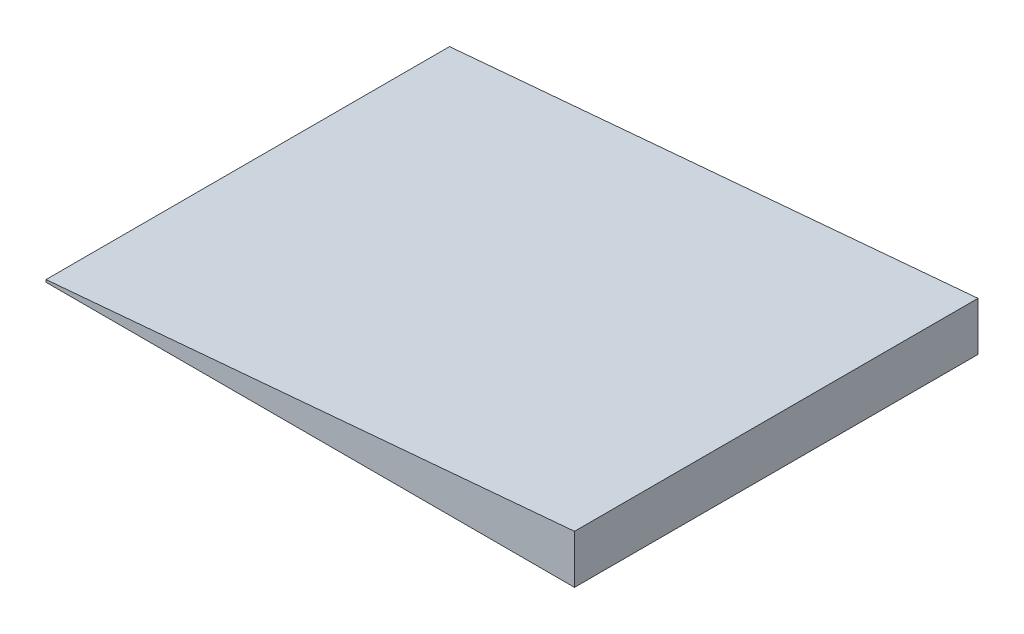
ISO-10303-21;
HEADER;
FILE_DESCRIPTION(('STEP AP214'),'2;1');
FILE_NAME('part.step','',(''),(''),'','','');
FILE_SCHEMA(('AUTOMOTIVE_DESIGN { 1 0 10303 214 1 1 1 1 }'));
ENDSEC;
DATA;
#1=APPLICATION_CONTEXT('core data for automotive mechanical design processes');
#2=APPLICATION_PROTOCOL_DEFINITION('international standard','automotive_design',2000,#1);
#3=PRODUCT_CONTEXT('',#1,'mechanical');
#4=PRODUCT('Part','Part','',(#3));
#5=PRODUCT_RELATED_PRODUCT_CATEGORY('part','',(#4));
#6=PRODUCT_DEFINITION_FORMATION('','',#4);
#7=PRODUCT_DEFINITION_CONTEXT('part definition',#1,'design');
#8=PRODUCT_DEFINITION('design','',#6,#7);
#9=PRODUCT_DEFINITION_SHAPE('','',#8);
#10=(LENGTH_UNIT() NAMED_UNIT(*) SI_UNIT(.MILLI.,.METRE.));
#11=(NAMED_UNIT(*) PLANE_ANGLE_UNIT() SI_UNIT($,.RADIAN.));
#12=(NAMED_UNIT(*) SI_UNIT($,.STERADIAN.) SOLID_ANGLE_UNIT());
#13=UNCERTAINTY_MEASURE_WITH_UNIT(LENGTH_MEASURE(1.E-05),#10,'distance_accuracy_value','');
#14=(GEOMETRIC_REPRESENTATION_CONTEXT(3) GLOBAL_UNCERTAINTY_ASSIGNED_CONTEXT((#13)) GLOBAL_UNIT_ASSIGNED_CONTEXT((#10,
#11,#12)) REPRESENTATION_CONTEXT('',''));
#15=CARTESIAN_POINT('',(0.,0.,0.));
#16=DIRECTION('',(0.,0.,1.));
#17=DIRECTION('',(1.,0.,0.));
#18=AXIS2_PLACEMENT_3D('',#15,#16,#17);
#19=CARTESIAN_POINT('',(-81.5693580169282,15.,62.2771656020037));
#20=DIRECTION('',(1.,0.,0.));
#21=DIRECTION('',(0.,0.,-1.));
#22=AXIS2_PLACEMENT_3D('',#19,#20,#21);
#23=PLANE('',#22);
#24=DIRECTION('',(0.,0.,1.));
#25=VECTOR('',#24,1.);
#26=CARTESIAN_POINT('',(-81.5693580169282,0.727211764862635,62.2771656020037));
#27=LINE('',#26,#25);
#28=CARTESIAN_POINT('',(-81.5693580169282,0.727211764862634,-62.2771656020037));
#29=VERTEX_POINT('',#28);
#30=CARTESIAN_POINT('',(-81.5693580169282,0.727211764862635,62.2771656020037));
#31=VERTEX_POINT('',#30);
#32=EDGE_CURVE('E112',#29,#31,#27,.T.);
#33=ORIENTED_EDGE('',*,*,#32,.F.);
#34=DIRECTION('',(0.,-1.,0.));
#35=VECTOR('',#34,1.);
#36=CARTESIAN_POINT('',(-81.5693580169282,15.,-62.2771656020037));
#37=LINE('',#36,#35);
#38=CARTESIAN_POINT('',(-81.5693580169282,0.,-62.2771656020037));
#39=VERTEX_POINT('',#38);
#40=EDGE_CURVE('E94',#29,#39,#37,.T.);
#41=ORIENTED_EDGE('',*,*,#40,.T.);
#42=DIRECTION('',(0.,0.,1.));
#43=VECTOR('',#42,1.);
#44=CARTESIAN_POINT('',(-81.5693580169282,0.,62.2771656020037));
#45=LINE('',#44,#43);
#46=CARTESIAN_POINT('',(-81.5693580169282,0.,62.2771656020037));
#47=VERTEX_POINT('',#46);
#48=EDGE_CURVE('E98',#39,#47,#45,.T.);
#49=ORIENTED_EDGE('',*,*,#48,.T.);
#50=DIRECTION('',(0.,-1.,0.));
#51=VECTOR('',#50,1.);
#52=CARTESIAN_POINT('',(-81.5693580169282,15.,62.2771656020037));
#53=LINE('',#52,#51);
#54=EDGE_CURVE('E11',#31,#47,#53,.T.);
#55=ORIENTED_EDGE('',*,*,#54,.F.);
#56=EDGE_LOOP('',(#33,#41,#49,#55));
#57=FACE_BOUND('',#56,.T.);
#58=ADVANCED_FACE('F39',(#57),#23,.F.);
#59=CARTESIAN_POINT('',(81.5693580169282,15.,62.2771656020037));
#60=DIRECTION('',(0.,0.,-1.));
#61=DIRECTION('',(-1.,0.,0.));
#62=AXIS2_PLACEMENT_3D('',#59,#60,#61);
#63=PLANE('',#62);
#64=DIRECTION('',(0.996194698091746,0.0871557427476583,0.));
#65=VECTOR('',#64,1.);
#66=CARTESIAN_POINT('',(81.5693580169282,15.,62.2771656020037));
#67=LINE('',#66,#65);
#68=CARTESIAN_POINT('',(81.5693580169282,15.,62.2771656020037));
#69=VERTEX_POINT('',#68);
#70=EDGE_CURVE('E55',#31,#69,#67,.T.);
#71=ORIENTED_EDGE('',*,*,#70,.F.);
#72=ORIENTED_EDGE('',*,*,#54,.T.);
#73=DIRECTION('',(1.,0.,0.));
#74=VECTOR('',#73,1.);
#75=CARTESIAN_POINT('',(81.5693580169282,0.,62.2771656020037));
#76=LINE('',#75,#74);
#77=CARTESIAN_POINT('',(81.5693580169282,0.,62.2771656020037));
#78=VERTEX_POINT('',#77);
#79=EDGE_CURVE('E83',#47,#78,#76,.T.);
#80=ORIENTED_EDGE('',*,*,#79,.T.);
#81=DIRECTION('',(0.,-1.,0.));
#82=VECTOR('',#81,1.);
#83=CARTESIAN_POINT('',(81.5693580169282,15.,62.2771656020037));
#84=LINE('',#83,#82);
#85=EDGE_CURVE('E48',#69,#78,#84,.T.);
#86=ORIENTED_EDGE('',*,*,#85,.F.);
#87=EDGE_LOOP('',(#71,#72,#80,#86));
#88=FACE_BOUND('',#87,.T.);
#89=ADVANCED_FACE('F122',(#88),#63,.F.);
#90=CARTESIAN_POINT('',(81.5693580169282,15.,-62.2771656020037));
#91=DIRECTION('',(0.,0.,1.));
#92=DIRECTION('',(1.,0.,0.));
#93=AXIS2_PLACEMENT_3D('',#90,#91,#92);
#94=PLANE('',#93);
#95=DIRECTION('',(-0.996194698091746,-0.0871557427476583,0.));
#96=VECTOR('',#95,1.);
#97=CARTESIAN_POINT('',(81.5693580169282,15.,-62.2771656020037));
#98=LINE('',#97,#96);
#99=CARTESIAN_POINT('',(81.5693580169282,15.,-62.2771656020037));
#100=VERTEX_POINT('',#99);
#101=EDGE_CURVE('E92',#100,#29,#98,.T.);
#102=ORIENTED_EDGE('',*,*,#101,.F.);
#103=DIRECTION('',(0.,-1.,0.));
#104=VECTOR('',#103,1.);
#105=CARTESIAN_POINT('',(81.5693580169282,15.,-62.2771656020037));
#106=LINE('',#105,#104);
#107=CARTESIAN_POINT('',(81.5693580169282,0.,-62.2771656020037));
#108=VERTEX_POINT('',#107);
#109=EDGE_CURVE('E77',#100,#108,#106,.T.);
#110=ORIENTED_EDGE('',*,*,#109,.T.);
#111=DIRECTION('',(-1.,0.,0.));
#112=VECTOR('',#111,1.);
#113=CARTESIAN_POINT('',(81.5693580169282,0.,-62.2771656020037));
#114=LINE('',#113,#112);
#115=EDGE_CURVE('E82',#108,#39,#114,.T.);
#116=ORIENTED_EDGE('',*,*,#115,.T.);
#117=ORIENTED_EDGE('',*,*,#40,.F.);
#118=EDGE_LOOP('',(#102,#110,#116,#117));
#119=FACE_BOUND('',#118,.T.);
#120=ADVANCED_FACE('F88',(#119),#94,.F.);
#121=CARTESIAN_POINT('',(81.5693580169282,15.,62.2771656020037));
#122=DIRECTION('',(-1.,0.,0.));
#123=DIRECTION('',(0.,0.,1.));
#124=AXIS2_PLACEMENT_3D('',#121,#122,#123);
#125=PLANE('',#124);
#126=DIRECTION('',(0.,0.,-1.));
#127=VECTOR('',#126,1.);
#128=CARTESIAN_POINT('',(81.5693580169282,0.,62.2771656020037));
#129=LINE('',#128,#127);
#130=EDGE_CURVE('E72',#78,#108,#129,.T.);
#131=ORIENTED_EDGE('',*,*,#130,.T.);
#132=ORIENTED_EDGE('',*,*,#109,.F.);
#133=DIRECTION('',(0.,0.,-1.));
#134=VECTOR('',#133,1.);
#135=CARTESIAN_POINT('',(81.5693580169282,15.,62.2771656020037));
#136=LINE('',#135,#134);
#137=EDGE_CURVE('E100',#69,#100,#136,.T.);
#138=ORIENTED_EDGE('',*,*,#137,.F.);
#139=ORIENTED_EDGE('',*,*,#85,.T.);
#140=EDGE_LOOP('',(#131,#132,#138,#139));
#141=FACE_BOUND('',#140,.T.);
#142=ADVANCED_FACE('F74',(#141),#125,.F.);
#143=CARTESIAN_POINT('',(0.,0.,0.));
#144=DIRECTION('',(0.,1.,0.));
#145=DIRECTION('',(0.,0.,1.));
#146=AXIS2_PLACEMENT_3D('',#143,#144,#145);
#147=PLANE('',#146);
#148=ORIENTED_EDGE('',*,*,#48,.F.);
#149=ORIENTED_EDGE('',*,*,#115,.F.);
#150=ORIENTED_EDGE('',*,*,#130,.F.);
#151=ORIENTED_EDGE('',*,*,#79,.F.);
#152=EDGE_LOOP('',(#148,#149,#150,#151));
#153=FACE_BOUND('',#152,.T.);
#154=ADVANCED_FACE('F96',(#153),#147,.F.);
#155=CARTESIAN_POINT('',(-0.682750415687577,7.80387296104104,0.));
#156=DIRECTION('',(-0.0871557427476583,0.996194698091746,0.));
#157=DIRECTION('',(-0.996194698091746,-0.0871557427476583,0.));
#158=AXIS2_PLACEMENT_3D('',#155,#156,#157);
#159=PLANE('',#158);
#160=ORIENTED_EDGE('',*,*,#70,.T.);
#161=ORIENTED_EDGE('',*,*,#137,.T.);
#162=ORIENTED_EDGE('',*,*,#101,.T.);
#163=ORIENTED_EDGE('',*,*,#32,.T.);
#164=EDGE_LOOP('',(#160,#161,#162,#163));
#165=FACE_BOUND('',#164,.T.);
#166=ADVANCED_FACE('F114',(#165),#159,.T.);
#167=CLOSED_SHELL('',(#58,#89,#120,#142,#154,#166));
#168=MANIFOLD_SOLID_BREP('B2',#167);
#169=ADVANCED_BREP_SHAPE_REPRESENTATION('',(#18,#168),#14);
#170=SHAPE_DEFINITION_REPRESENTATION(#9,#169);
ENDSEC;
END-ISO-10303-21;
